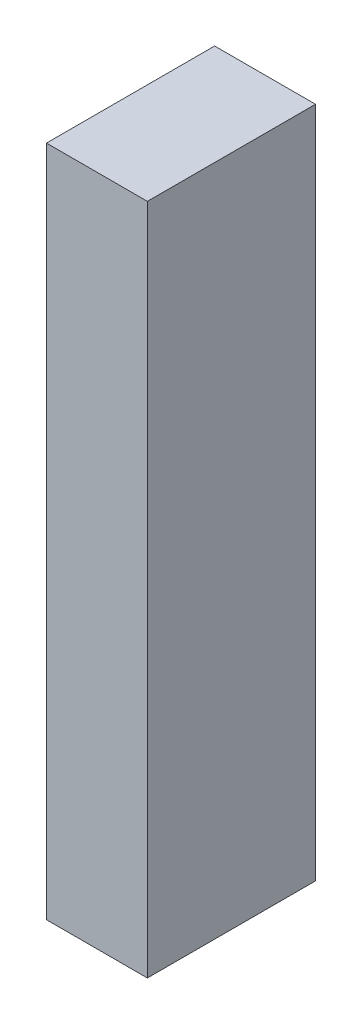
ISO-10303-21;
HEADER;
FILE_DESCRIPTION(('STEP AP214'),'2;1');
FILE_NAME('part.step','',(''),(''),'','','');
FILE_SCHEMA(('AUTOMOTIVE_DESIGN { 1 0 10303 214 1 1 1 1 }'));
ENDSEC;
DATA;
#1=APPLICATION_CONTEXT('core data for automotive mechanical design processes');
#2=APPLICATION_PROTOCOL_DEFINITION('international standard','automotive_design',2000,#1);
#3=PRODUCT_CONTEXT('',#1,'mechanical');
#4=PRODUCT('Part','Part','',(#3));
#5=PRODUCT_RELATED_PRODUCT_CATEGORY('part','',(#4));
#6=PRODUCT_DEFINITION_FORMATION('','',#4);
#7=PRODUCT_DEFINITION_CONTEXT('part definition',#1,'design');
#8=PRODUCT_DEFINITION('design','',#6,#7);
#9=PRODUCT_DEFINITION_SHAPE('','',#8);
#10=(LENGTH_UNIT() NAMED_UNIT(*) SI_UNIT(.MILLI.,.METRE.));
#11=(NAMED_UNIT(*) PLANE_ANGLE_UNIT() SI_UNIT($,.RADIAN.));
#12=(NAMED_UNIT(*) SI_UNIT($,.STERADIAN.) SOLID_ANGLE_UNIT());
#13=UNCERTAINTY_MEASURE_WITH_UNIT(LENGTH_MEASURE(1.E-05),#10,'distance_accuracy_value','');
#14=(GEOMETRIC_REPRESENTATION_CONTEXT(3) GLOBAL_UNCERTAINTY_ASSIGNED_CONTEXT((#13)) GLOBAL_UNIT_ASSIGNED_CONTEXT((#10,
#11,#12)) REPRESENTATION_CONTEXT('',''));
#15=CARTESIAN_POINT('',(0.,0.,0.));
#16=DIRECTION('',(0.,0.,1.));
#17=DIRECTION('',(1.,0.,0.));
#18=AXIS2_PLACEMENT_3D('',#15,#16,#17);
#19=CARTESIAN_POINT('',(1.5,20.,-2.5));
#20=DIRECTION('',(-1.,0.,0.));
#21=DIRECTION('',(0.,0.,1.));
#22=AXIS2_PLACEMENT_3D('',#19,#20,#21);
#23=PLANE('',#22);
#24=DIRECTION('',(0.,0.,-1.));
#25=VECTOR('',#24,1.);
#26=CARTESIAN_POINT('',(1.5,0.,-2.5));
#27=LINE('',#26,#25);
#28=CARTESIAN_POINT('',(1.5,0.,2.5));
#29=VERTEX_POINT('',#28);
#30=CARTESIAN_POINT('',(1.5,0.,-2.5));
#31=VERTEX_POINT('',#30);
#32=EDGE_CURVE('E113',#29,#31,#27,.T.);
#33=ORIENTED_EDGE('',*,*,#32,.T.);
#34=DIRECTION('',(0.,-1.,0.));
#35=VECTOR('',#34,1.);
#36=CARTESIAN_POINT('',(1.5,20.,-2.5));
#37=LINE('',#36,#35);
#38=CARTESIAN_POINT('',(1.5,20.,-2.5));
#39=VERTEX_POINT('',#38);
#40=EDGE_CURVE('E11',#39,#31,#37,.T.);
#41=ORIENTED_EDGE('',*,*,#40,.F.);
#42=DIRECTION('',(0.,0.,-1.));
#43=VECTOR('',#42,1.);
#44=CARTESIAN_POINT('',(1.5,20.,-2.5));
#45=LINE('',#44,#43);
#46=CARTESIAN_POINT('',(1.5,20.,2.5));
#47=VERTEX_POINT('',#46);
#48=EDGE_CURVE('E97',#47,#39,#45,.T.);
#49=ORIENTED_EDGE('',*,*,#48,.F.);
#50=DIRECTION('',(0.,-1.,0.));
#51=VECTOR('',#50,1.);
#52=CARTESIAN_POINT('',(1.5,20.,2.5));
#53=LINE('',#52,#51);
#54=EDGE_CURVE('E109',#47,#29,#53,.T.);
#55=ORIENTED_EDGE('',*,*,#54,.T.);
#56=EDGE_LOOP('',(#33,#41,#49,#55));
#57=FACE_BOUND('',#56,.T.);
#58=ADVANCED_FACE('F45',(#57),#23,.F.);
#59=CARTESIAN_POINT('',(-1.5,20.,-2.5));
#60=DIRECTION('',(0.,0.,1.));
#61=DIRECTION('',(1.,0.,0.));
#62=AXIS2_PLACEMENT_3D('',#59,#60,#61);
#63=PLANE('',#62);
#64=DIRECTION('',(-1.,0.,0.));
#65=VECTOR('',#64,1.);
#66=CARTESIAN_POINT('',(-1.5,0.,-2.5));
#67=LINE('',#66,#65);
#68=CARTESIAN_POINT('',(-1.5,0.,-2.5));
#69=VERTEX_POINT('',#68);
#70=EDGE_CURVE('E102',#31,#69,#67,.T.);
#71=ORIENTED_EDGE('',*,*,#70,.T.);
#72=DIRECTION('',(0.,-1.,0.));
#73=VECTOR('',#72,1.);
#74=CARTESIAN_POINT('',(-1.5,20.,-2.5));
#75=LINE('',#74,#73);
#76=CARTESIAN_POINT('',(-1.5,20.,-2.5));
#77=VERTEX_POINT('',#76);
#78=EDGE_CURVE('E54',#77,#69,#75,.T.);
#79=ORIENTED_EDGE('',*,*,#78,.F.);
#80=DIRECTION('',(-1.,0.,0.));
#81=VECTOR('',#80,1.);
#82=CARTESIAN_POINT('',(-1.5,20.,-2.5));
#83=LINE('',#82,#81);
#84=EDGE_CURVE('E92',#39,#77,#83,.T.);
#85=ORIENTED_EDGE('',*,*,#84,.F.);
#86=ORIENTED_EDGE('',*,*,#40,.T.);
#87=EDGE_LOOP('',(#71,#79,#85,#86));
#88=FACE_BOUND('',#87,.T.);
#89=ADVANCED_FACE('F101',(#88),#63,.F.);
#90=CARTESIAN_POINT('',(-1.5,20.,-2.5));
#91=DIRECTION('',(1.,0.,0.));
#92=DIRECTION('',(0.,0.,-1.));
#93=AXIS2_PLACEMENT_3D('',#90,#91,#92);
#94=PLANE('',#93);
#95=DIRECTION('',(0.,0.,1.));
#96=VECTOR('',#95,1.);
#97=CARTESIAN_POINT('',(-1.5,0.,-2.5));
#98=LINE('',#97,#96);
#99=CARTESIAN_POINT('',(-1.5,0.,2.5));
#100=VERTEX_POINT('',#99);
#101=EDGE_CURVE('E79',#69,#100,#98,.T.);
#102=ORIENTED_EDGE('',*,*,#101,.T.);
#103=DIRECTION('',(0.,-1.,0.));
#104=VECTOR('',#103,1.);
#105=CARTESIAN_POINT('',(-1.5,20.,2.5));
#106=LINE('',#105,#104);
#107=CARTESIAN_POINT('',(-1.5,20.,2.5));
#108=VERTEX_POINT('',#107);
#109=EDGE_CURVE('E104',#108,#100,#106,.T.);
#110=ORIENTED_EDGE('',*,*,#109,.F.);
#111=DIRECTION('',(0.,0.,1.));
#112=VECTOR('',#111,1.);
#113=CARTESIAN_POINT('',(-1.5,20.,-2.5));
#114=LINE('',#113,#112);
#115=EDGE_CURVE('E95',#77,#108,#114,.T.);
#116=ORIENTED_EDGE('',*,*,#115,.F.);
#117=ORIENTED_EDGE('',*,*,#78,.T.);
#118=EDGE_LOOP('',(#102,#110,#116,#117));
#119=FACE_BOUND('',#118,.T.);
#120=ADVANCED_FACE('F105',(#119),#94,.F.);
#121=CARTESIAN_POINT('',(-1.5,20.,2.5));
#122=DIRECTION('',(0.,0.,-1.));
#123=DIRECTION('',(-1.,0.,0.));
#124=AXIS2_PLACEMENT_3D('',#121,#122,#123);
#125=PLANE('',#124);
#126=DIRECTION('',(1.,0.,0.));
#127=VECTOR('',#126,1.);
#128=CARTESIAN_POINT('',(-1.5,0.,2.5));
#129=LINE('',#128,#127);
#130=EDGE_CURVE('E85',#100,#29,#129,.T.);
#131=ORIENTED_EDGE('',*,*,#130,.T.);
#132=ORIENTED_EDGE('',*,*,#54,.F.);
#133=DIRECTION('',(1.,0.,0.));
#134=VECTOR('',#133,1.);
#135=CARTESIAN_POINT('',(-1.5,20.,2.5));
#136=LINE('',#135,#134);
#137=EDGE_CURVE('E62',#108,#47,#136,.T.);
#138=ORIENTED_EDGE('',*,*,#137,.F.);
#139=ORIENTED_EDGE('',*,*,#109,.T.);
#140=EDGE_LOOP('',(#131,#132,#138,#139));
#141=FACE_BOUND('',#140,.T.);
#142=ADVANCED_FACE('F126',(#141),#125,.F.);
#143=CARTESIAN_POINT('',(0.,20.,0.));
#144=DIRECTION('',(0.,1.,0.));
#145=DIRECTION('',(0.,0.,1.));
#146=AXIS2_PLACEMENT_3D('',#143,#144,#145);
#147=PLANE('',#146);
#148=ORIENTED_EDGE('',*,*,#48,.T.);
#149=ORIENTED_EDGE('',*,*,#84,.T.);
#150=ORIENTED_EDGE('',*,*,#115,.T.);
#151=ORIENTED_EDGE('',*,*,#137,.T.);
#152=EDGE_LOOP('',(#148,#149,#150,#151));
#153=FACE_BOUND('',#152,.T.);
#154=ADVANCED_FACE('F93',(#153),#147,.T.);
#155=CARTESIAN_POINT('',(0.,0.,0.));
#156=DIRECTION('',(0.,1.,0.));
#157=DIRECTION('',(0.,0.,1.));
#158=AXIS2_PLACEMENT_3D('',#155,#156,#157);
#159=PLANE('',#158);
#160=ORIENTED_EDGE('',*,*,#32,.F.);
#161=ORIENTED_EDGE('',*,*,#130,.F.);
#162=ORIENTED_EDGE('',*,*,#101,.F.);
#163=ORIENTED_EDGE('',*,*,#70,.F.);
#164=EDGE_LOOP('',(#160,#161,#162,#163));
#165=FACE_BOUND('',#164,.T.);
#166=ADVANCED_FACE('F129',(#165),#159,.F.);
#167=CLOSED_SHELL('',(#58,#89,#120,#142,#154,#166));
#168=MANIFOLD_SOLID_BREP('B2',#167);
#169=ADVANCED_BREP_SHAPE_REPRESENTATION('',(#18,#168),#14);
#170=SHAPE_DEFINITION_REPRESENTATION(#9,#169);
ENDSEC;
END-ISO-10303-21;
